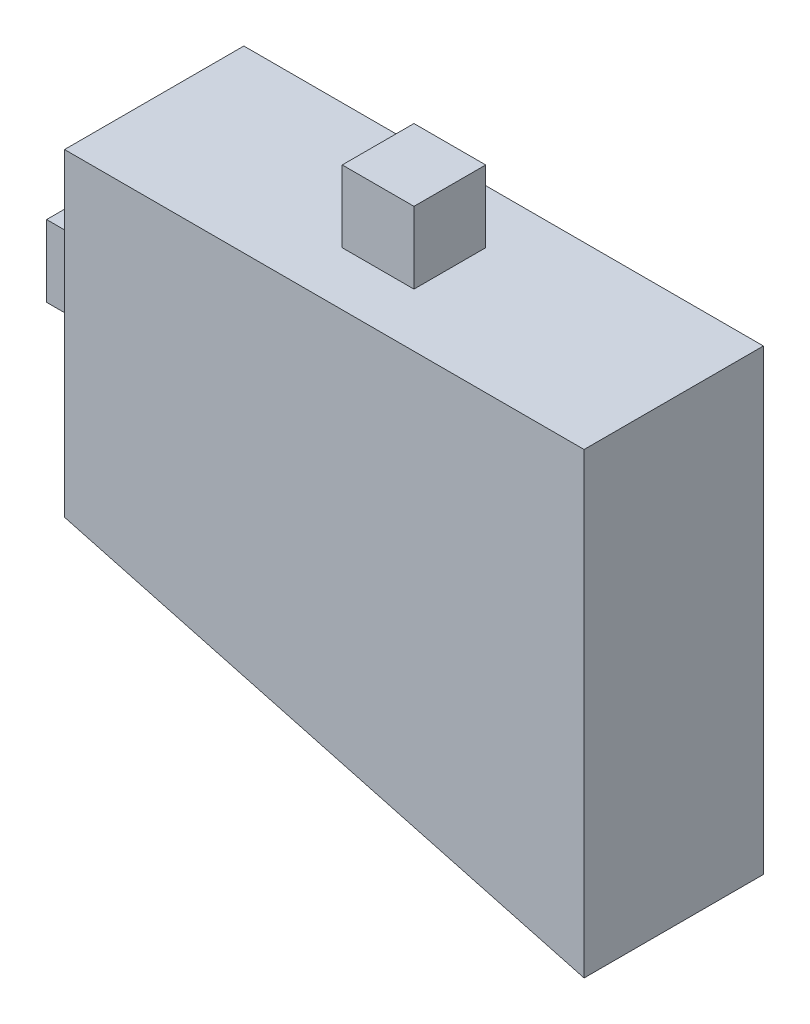
ISO-10303-21;
HEADER;
FILE_DESCRIPTION(('STEP AP214'),'2;1');
FILE_NAME('part.step','',(''),(''),'','','');
FILE_SCHEMA(('AUTOMOTIVE_DESIGN { 1 0 10303 214 1 1 1 1 }'));
ENDSEC;
DATA;
#1=APPLICATION_CONTEXT('core data for automotive mechanical design processes');
#2=APPLICATION_PROTOCOL_DEFINITION('international standard','automotive_design',2000,#1);
#3=PRODUCT_CONTEXT('',#1,'mechanical');
#4=PRODUCT('Part','Part','',(#3));
#5=PRODUCT_RELATED_PRODUCT_CATEGORY('part','',(#4));
#6=PRODUCT_DEFINITION_FORMATION('','',#4);
#7=PRODUCT_DEFINITION_CONTEXT('part definition',#1,'design');
#8=PRODUCT_DEFINITION('design','',#6,#7);
#9=PRODUCT_DEFINITION_SHAPE('','',#8);
#10=(LENGTH_UNIT() NAMED_UNIT(*) SI_UNIT(.MILLI.,.METRE.));
#11=(NAMED_UNIT(*) PLANE_ANGLE_UNIT() SI_UNIT($,.RADIAN.));
#12=(NAMED_UNIT(*) SI_UNIT($,.STERADIAN.) SOLID_ANGLE_UNIT());
#13=UNCERTAINTY_MEASURE_WITH_UNIT(LENGTH_MEASURE(1.E-05),#10,'distance_accuracy_value','');
#14=(GEOMETRIC_REPRESENTATION_CONTEXT(3) GLOBAL_UNCERTAINTY_ASSIGNED_CONTEXT((#13)) GLOBAL_UNIT_ASSIGNED_CONTEXT((#10,
#11,#12)) REPRESENTATION_CONTEXT('',''));
#15=CARTESIAN_POINT('',(0.,0.,0.));
#16=DIRECTION('',(0.,0.,1.));
#17=DIRECTION('',(1.,0.,0.));
#18=AXIS2_PLACEMENT_3D('',#15,#16,#17);
#19=CARTESIAN_POINT('',(110.57764421791,0.,0.));
#20=DIRECTION('',(-1.,0.,0.));
#21=DIRECTION('',(0.,-1.,0.));
#22=AXIS2_PLACEMENT_3D('',#19,#20,#21);
#23=PLANE('',#22);
#24=DIRECTION('',(0.,-1.,0.));
#25=VECTOR('',#24,1.);
#26=CARTESIAN_POINT('',(110.57764421791,31.6424845178765,50.));
#27=LINE('',#26,#25);
#28=CARTESIAN_POINT('',(110.57764421791,-18.2414554532318,50.));
#29=VERTEX_POINT('',#28);
#30=CARTESIAN_POINT('',(110.57764421791,-107.064312218609,50.));
#31=VERTEX_POINT('',#30);
#32=EDGE_CURVE('E241',#29,#31,#27,.T.);
#33=ORIENTED_EDGE('',*,*,#32,.F.);
#34=DIRECTION('',(0.,0.,-1.));
#35=VECTOR('',#34,1.);
#36=CARTESIAN_POINT('',(110.57764421791,-18.2414554532318,0.));
#37=LINE('',#36,#35);
#38=CARTESIAN_POINT('',(110.57764421791,-18.2414554532318,0.));
#39=VERTEX_POINT('',#38);
#40=EDGE_CURVE('E245',#29,#39,#37,.T.);
#41=ORIENTED_EDGE('',*,*,#40,.T.);
#42=DIRECTION('',(0.,-1.,0.));
#43=VECTOR('',#42,1.);
#44=CARTESIAN_POINT('',(110.57764421791,31.7585445467682,0.));
#45=LINE('',#44,#43);
#46=CARTESIAN_POINT('',(110.57764421791,-107.064312218609,0.));
#47=VERTEX_POINT('',#46);
#48=EDGE_CURVE('E223',#39,#47,#45,.T.);
#49=ORIENTED_EDGE('',*,*,#48,.T.);
#50=DIRECTION('',(0.,0.,-1.));
#51=VECTOR('',#50,1.);
#52=CARTESIAN_POINT('',(110.57764421791,-107.064312218609,50.));
#53=LINE('',#52,#51);
#54=EDGE_CURVE('E229',#31,#47,#53,.T.);
#55=ORIENTED_EDGE('',*,*,#54,.F.);
#56=EDGE_LOOP('',(#33,#41,#49,#55));
#57=FACE_BOUND('',#56,.T.);
#58=DIRECTION('',(0.,0.,1.));
#59=VECTOR('',#58,1.);
#60=CARTESIAN_POINT('',(110.57764421791,-52.6528838359204,0.));
#61=LINE('',#60,#59);
#62=CARTESIAN_POINT('',(110.57764421791,-52.6528838359204,15.));
#63=VERTEX_POINT('',#62);
#64=CARTESIAN_POINT('',(110.57764421791,-52.6528838359204,35.));
#65=VERTEX_POINT('',#64);
#66=EDGE_CURVE('E200',#63,#65,#61,.T.);
#67=ORIENTED_EDGE('',*,*,#66,.T.);
#68=DIRECTION('',(0.,-1.,0.));
#69=VECTOR('',#68,1.);
#70=CARTESIAN_POINT('',(110.57764421791,0.,35.));
#71=LINE('',#70,#69);
#72=CARTESIAN_POINT('',(110.57764421791,-72.6528838359204,35.));
#73=VERTEX_POINT('',#72);
#74=EDGE_CURVE('E140',#65,#73,#71,.T.);
#75=ORIENTED_EDGE('',*,*,#74,.T.);
#76=DIRECTION('',(0.,0.,1.));
#77=VECTOR('',#76,1.);
#78=CARTESIAN_POINT('',(110.57764421791,-72.6528838359204,0.));
#79=LINE('',#78,#77);
#80=CARTESIAN_POINT('',(110.57764421791,-72.6528838359204,15.));
#81=VERTEX_POINT('',#80);
#82=EDGE_CURVE('E186',#81,#73,#79,.T.);
#83=ORIENTED_EDGE('',*,*,#82,.F.);
#84=DIRECTION('',(0.,-1.,0.));
#85=VECTOR('',#84,1.);
#86=CARTESIAN_POINT('',(110.57764421791,0.,15.0000000000002));
#87=LINE('',#86,#85);
#88=EDGE_CURVE('E204',#63,#81,#87,.T.);
#89=ORIENTED_EDGE('',*,*,#88,.F.);
#90=EDGE_LOOP('',(#67,#75,#83,#89));
#91=FACE_BOUND('',#90,.T.);
#92=ADVANCED_FACE('F41',(#57,#91),#23,.T.);
#93=CARTESIAN_POINT('',(0.,-18.2414554532318,0.));
#94=DIRECTION('',(0.,-1.,0.));
#95=DIRECTION('',(1.,0.,0.));
#96=AXIS2_PLACEMENT_3D('',#93,#94,#95);
#97=PLANE('',#96);
#98=DIRECTION('',(1.,0.,0.));
#99=VECTOR('',#98,1.);
#100=CARTESIAN_POINT('',(0.,-18.2414554532318,15.));
#101=LINE('',#100,#99);
#102=CARTESIAN_POINT('',(173.02208118959,-18.2414554532318,15.));
#103=VERTEX_POINT('',#102);
#104=CARTESIAN_POINT('',(193.02208118959,-18.2414554532318,15.));
#105=VERTEX_POINT('',#104);
#106=EDGE_CURVE('E58',#103,#105,#101,.T.);
#107=ORIENTED_EDGE('',*,*,#106,.T.);
#108=DIRECTION('',(0.,0.,1.));
#109=VECTOR('',#108,1.);
#110=CARTESIAN_POINT('',(193.02208118959,-18.2414554532318,-2.67871948497186E-13));
#111=LINE('',#110,#109);
#112=CARTESIAN_POINT('',(193.02208118959,-18.2414554532318,35.));
#113=VERTEX_POINT('',#112);
#114=EDGE_CURVE('E136',#105,#113,#111,.T.);
#115=ORIENTED_EDGE('',*,*,#114,.T.);
#116=DIRECTION('',(1.,0.,0.));
#117=VECTOR('',#116,1.);
#118=CARTESIAN_POINT('',(0.,-18.2414554532318,35.));
#119=LINE('',#118,#117);
#120=CARTESIAN_POINT('',(173.02208118959,-18.2414554532318,35.));
#121=VERTEX_POINT('',#120);
#122=EDGE_CURVE('E151',#121,#113,#119,.T.);
#123=ORIENTED_EDGE('',*,*,#122,.F.);
#124=DIRECTION('',(0.,0.,1.));
#125=VECTOR('',#124,1.);
#126=CARTESIAN_POINT('',(173.02208118959,-18.2414554532318,-2.40116372881557E-13));
#127=LINE('',#126,#125);
#128=EDGE_CURVE('E63',#103,#121,#127,.T.);
#129=ORIENTED_EDGE('',*,*,#128,.F.);
#130=EDGE_LOOP('',(#107,#115,#123,#129));
#131=FACE_BOUND('',#130,.T.);
#132=ORIENTED_EDGE('',*,*,#40,.F.);
#133=DIRECTION('',(1.,0.,0.));
#134=VECTOR('',#133,1.);
#135=CARTESIAN_POINT('',(45.6887702745492,-18.2414554532318,50.));
#136=LINE('',#135,#134);
#137=CARTESIAN_POINT('',(255.46651816127,-18.2414554532318,50.));
#138=VERTEX_POINT('',#137);
#139=EDGE_CURVE('E228',#29,#138,#136,.T.);
#140=ORIENTED_EDGE('',*,*,#139,.T.);
#141=DIRECTION('',(0.,0.,-1.));
#142=VECTOR('',#141,1.);
#143=CARTESIAN_POINT('',(255.46651816127,-18.2414554532318,50.));
#144=LINE('',#143,#142);
#145=CARTESIAN_POINT('',(255.46651816127,-18.2414554532318,0.));
#146=VERTEX_POINT('',#145);
#147=EDGE_CURVE('E224',#138,#146,#144,.T.);
#148=ORIENTED_EDGE('',*,*,#147,.T.);
#149=DIRECTION('',(1.,0.,0.));
#150=VECTOR('',#149,1.);
#151=CARTESIAN_POINT('',(-34.3112297254508,-18.2414554532318,0.));
#152=LINE('',#151,#150);
#153=EDGE_CURVE('E236',#39,#146,#152,.T.);
#154=ORIENTED_EDGE('',*,*,#153,.F.);
#155=EDGE_LOOP('',(#132,#140,#148,#154));
#156=FACE_BOUND('',#155,.T.);
#157=ADVANCED_FACE('F270',(#131,#156),#97,.F.);
#158=CARTESIAN_POINT('',(45.6887702745492,31.6424845178765,50.));
#159=DIRECTION('',(0.,0.,1.));
#160=DIRECTION('',(1.,0.,0.));
#161=AXIS2_PLACEMENT_3D('',#158,#159,#160);
#162=PLANE('',#161);
#163=ORIENTED_EDGE('',*,*,#139,.F.);
#164=ORIENTED_EDGE('',*,*,#32,.T.);
#165=DIRECTION('',(-0.96592582628907,0.258819045102514,0.));
#166=VECTOR('',#165,1.);
#167=CARTESIAN_POINT('',(-34.3112297254508,-68.2414554532319,50.));
#168=LINE('',#167,#166);
#169=CARTESIAN_POINT('',(255.46651816127,-145.887168983986,50.));
#170=VERTEX_POINT('',#169);
#171=EDGE_CURVE('E45',#170,#31,#168,.T.);
#172=ORIENTED_EDGE('',*,*,#171,.F.);
#173=DIRECTION('',(0.,-1.,0.));
#174=VECTOR('',#173,1.);
#175=CARTESIAN_POINT('',(255.46651816127,-145.887168983986,50.));
#176=LINE('',#175,#174);
#177=EDGE_CURVE('E230',#138,#170,#176,.T.);
#178=ORIENTED_EDGE('',*,*,#177,.F.);
#179=EDGE_LOOP('',(#163,#164,#172,#178));
#180=FACE_BOUND('',#179,.T.);
#181=ADVANCED_FACE('F274',(#180),#162,.T.);
#182=CARTESIAN_POINT('',(-34.3112297254508,-68.2414554532319,50.));
#183=DIRECTION('',(-0.258819045102514,-0.96592582628907,0.));
#184=DIRECTION('',(0.96592582628907,-0.258819045102514,0.));
#185=AXIS2_PLACEMENT_3D('',#182,#183,#184);
#186=PLANE('',#185);
#187=ORIENTED_EDGE('',*,*,#171,.T.);
#188=ORIENTED_EDGE('',*,*,#54,.T.);
#189=DIRECTION('',(-0.96592582628907,0.258819045102514,0.));
#190=VECTOR('',#189,1.);
#191=CARTESIAN_POINT('',(-34.3112297254508,-68.2414554532319,0.));
#192=LINE('',#191,#190);
#193=CARTESIAN_POINT('',(255.46651816127,-145.887168983986,0.));
#194=VERTEX_POINT('',#193);
#195=EDGE_CURVE('E233',#194,#47,#192,.T.);
#196=ORIENTED_EDGE('',*,*,#195,.F.);
#197=DIRECTION('',(0.,0.,-1.));
#198=VECTOR('',#197,1.);
#199=CARTESIAN_POINT('',(255.46651816127,-145.887168983986,50.));
#200=LINE('',#199,#198);
#201=EDGE_CURVE('E11',#170,#194,#200,.T.);
#202=ORIENTED_EDGE('',*,*,#201,.F.);
#203=EDGE_LOOP('',(#187,#188,#196,#202));
#204=FACE_BOUND('',#203,.T.);
#205=ADVANCED_FACE('F263',(#204),#186,.T.);
#206=CARTESIAN_POINT('',(-34.3112297254508,31.7585445467682,0.));
#207=DIRECTION('',(0.,0.,1.));
#208=DIRECTION('',(1.,0.,0.));
#209=AXIS2_PLACEMENT_3D('',#206,#207,#208);
#210=PLANE('',#209);
#211=ORIENTED_EDGE('',*,*,#48,.F.);
#212=ORIENTED_EDGE('',*,*,#153,.T.);
#213=DIRECTION('',(0.,-1.,0.));
#214=VECTOR('',#213,1.);
#215=CARTESIAN_POINT('',(255.46651816127,-145.887168983986,0.));
#216=LINE('',#215,#214);
#217=EDGE_CURVE('E234',#146,#194,#216,.T.);
#218=ORIENTED_EDGE('',*,*,#217,.T.);
#219=ORIENTED_EDGE('',*,*,#195,.T.);
#220=EDGE_LOOP('',(#211,#212,#218,#219));
#221=FACE_BOUND('',#220,.T.);
#222=ADVANCED_FACE('F43',(#221),#210,.F.);
#223=CARTESIAN_POINT('',(255.46651816127,-145.887168983986,50.));
#224=DIRECTION('',(1.,0.,0.));
#225=DIRECTION('',(0.,0.,-1.));
#226=AXIS2_PLACEMENT_3D('',#223,#224,#225);
#227=PLANE('',#226);
#228=ORIENTED_EDGE('',*,*,#147,.F.);
#229=ORIENTED_EDGE('',*,*,#177,.T.);
#230=ORIENTED_EDGE('',*,*,#201,.T.);
#231=ORIENTED_EDGE('',*,*,#217,.F.);
#232=EDGE_LOOP('',(#228,#229,#230,#231));
#233=FACE_BOUND('',#232,.T.);
#234=ADVANCED_FACE('F276',(#233),#227,.T.);
#235=CARTESIAN_POINT('',(90.5776442179097,0.,35.));
#236=DIRECTION('',(0.,0.,1.));
#237=DIRECTION('',(1.,0.,0.));
#238=AXIS2_PLACEMENT_3D('',#235,#236,#237);
#239=PLANE('',#238);
#240=ORIENTED_EDGE('',*,*,#74,.F.);
#241=DIRECTION('',(1.,0.,0.));
#242=VECTOR('',#241,1.);
#243=CARTESIAN_POINT('',(90.5776442179097,-52.6528838359204,35.));
#244=LINE('',#243,#242);
#245=CARTESIAN_POINT('',(90.5776442179097,-52.6528838359204,35.));
#246=VERTEX_POINT('',#245);
#247=EDGE_CURVE('E219',#246,#65,#244,.T.);
#248=ORIENTED_EDGE('',*,*,#247,.F.);
#249=DIRECTION('',(0.,-1.,0.));
#250=VECTOR('',#249,1.);
#251=CARTESIAN_POINT('',(90.5776442179097,0.,35.));
#252=LINE('',#251,#250);
#253=CARTESIAN_POINT('',(90.5776442179097,-72.6528838359204,35.));
#254=VERTEX_POINT('',#253);
#255=EDGE_CURVE('E181',#246,#254,#252,.T.);
#256=ORIENTED_EDGE('',*,*,#255,.T.);
#257=DIRECTION('',(1.,0.,0.));
#258=VECTOR('',#257,1.);
#259=CARTESIAN_POINT('',(90.5776442179097,-72.6528838359204,35.));
#260=LINE('',#259,#258);
#261=EDGE_CURVE('E196',#254,#73,#260,.T.);
#262=ORIENTED_EDGE('',*,*,#261,.T.);
#263=EDGE_LOOP('',(#240,#248,#256,#262));
#264=FACE_BOUND('',#263,.T.);
#265=ADVANCED_FACE('F278',(#264),#239,.T.);
#266=CARTESIAN_POINT('',(90.5776442179097,-52.6528838359204,0.));
#267=DIRECTION('',(0.,1.,0.));
#268=DIRECTION('',(-1.,0.,0.));
#269=AXIS2_PLACEMENT_3D('',#266,#267,#268);
#270=PLANE('',#269);
#271=ORIENTED_EDGE('',*,*,#66,.F.);
#272=DIRECTION('',(1.,0.,0.));
#273=VECTOR('',#272,1.);
#274=CARTESIAN_POINT('',(90.5776442179097,-52.6528838359204,15.));
#275=LINE('',#274,#273);
#276=CARTESIAN_POINT('',(90.5776442179097,-52.6528838359204,15.));
#277=VERTEX_POINT('',#276);
#278=EDGE_CURVE('E216',#277,#63,#275,.T.);
#279=ORIENTED_EDGE('',*,*,#278,.F.);
#280=DIRECTION('',(0.,0.,1.));
#281=VECTOR('',#280,1.);
#282=CARTESIAN_POINT('',(90.5776442179097,-52.6528838359204,0.));
#283=LINE('',#282,#281);
#284=EDGE_CURVE('E185',#277,#246,#283,.T.);
#285=ORIENTED_EDGE('',*,*,#284,.T.);
#286=ORIENTED_EDGE('',*,*,#247,.T.);
#287=EDGE_LOOP('',(#271,#279,#285,#286));
#288=FACE_BOUND('',#287,.T.);
#289=ADVANCED_FACE('F285',(#288),#270,.T.);
#290=CARTESIAN_POINT('',(90.5776442179097,0.,15.0000000000002));
#291=DIRECTION('',(0.,0.,1.));
#292=DIRECTION('',(0.,-1.,0.));
#293=AXIS2_PLACEMENT_3D('',#290,#291,#292);
#294=PLANE('',#293);
#295=ORIENTED_EDGE('',*,*,#88,.T.);
#296=DIRECTION('',(1.,0.,0.));
#297=VECTOR('',#296,1.);
#298=CARTESIAN_POINT('',(90.5776442179097,-72.6528838359204,15.));
#299=LINE('',#298,#297);
#300=CARTESIAN_POINT('',(90.5776442179097,-72.6528838359204,15.));
#301=VERTEX_POINT('',#300);
#302=EDGE_CURVE('E212',#301,#81,#299,.T.);
#303=ORIENTED_EDGE('',*,*,#302,.F.);
#304=DIRECTION('',(0.,-1.,0.));
#305=VECTOR('',#304,1.);
#306=CARTESIAN_POINT('',(90.5776442179097,0.,15.0000000000002));
#307=LINE('',#306,#305);
#308=EDGE_CURVE('E190',#277,#301,#307,.T.);
#309=ORIENTED_EDGE('',*,*,#308,.F.);
#310=ORIENTED_EDGE('',*,*,#278,.T.);
#311=EDGE_LOOP('',(#295,#303,#309,#310));
#312=FACE_BOUND('',#311,.T.);
#313=ADVANCED_FACE('F332',(#312),#294,.F.);
#314=CARTESIAN_POINT('',(90.5776442179097,-72.6528838359204,0.));
#315=DIRECTION('',(0.,1.,0.));
#316=DIRECTION('',(-1.,0.,0.));
#317=AXIS2_PLACEMENT_3D('',#314,#315,#316);
#318=PLANE('',#317);
#319=ORIENTED_EDGE('',*,*,#82,.T.);
#320=ORIENTED_EDGE('',*,*,#261,.F.);
#321=DIRECTION('',(0.,0.,1.));
#322=VECTOR('',#321,1.);
#323=CARTESIAN_POINT('',(90.5776442179097,-72.6528838359204,0.));
#324=LINE('',#323,#322);
#325=EDGE_CURVE('E193',#301,#254,#324,.T.);
#326=ORIENTED_EDGE('',*,*,#325,.F.);
#327=ORIENTED_EDGE('',*,*,#302,.T.);
#328=EDGE_LOOP('',(#319,#320,#326,#327));
#329=FACE_BOUND('',#328,.T.);
#330=ADVANCED_FACE('F341',(#329),#318,.F.);
#331=CARTESIAN_POINT('',(90.5776442179097,0.,0.));
#332=DIRECTION('',(-1.,0.,0.));
#333=DIRECTION('',(0.,-1.,0.));
#334=AXIS2_PLACEMENT_3D('',#331,#332,#333);
#335=PLANE('',#334);
#336=ORIENTED_EDGE('',*,*,#255,.F.);
#337=ORIENTED_EDGE('',*,*,#284,.F.);
#338=ORIENTED_EDGE('',*,*,#308,.T.);
#339=ORIENTED_EDGE('',*,*,#325,.T.);
#340=EDGE_LOOP('',(#336,#337,#338,#339));
#341=FACE_BOUND('',#340,.T.);
#342=ADVANCED_FACE('F350',(#341),#335,.T.);
#343=CARTESIAN_POINT('',(193.02208118959,1.75854454676817,-2.67871948497186E-13));
#344=DIRECTION('',(1.,0.,0.));
#345=DIRECTION('',(0.,0.,-1.));
#346=AXIS2_PLACEMENT_3D('',#343,#344,#345);
#347=PLANE('',#346);
#348=ORIENTED_EDGE('',*,*,#114,.F.);
#349=DIRECTION('',(0.,-1.,0.));
#350=VECTOR('',#349,1.);
#351=CARTESIAN_POINT('',(193.02208118959,1.75854454676817,15.));
#352=LINE('',#351,#350);
#353=CARTESIAN_POINT('',(193.02208118959,1.75854454676817,15.));
#354=VERTEX_POINT('',#353);
#355=EDGE_CURVE('E131',#354,#105,#352,.T.);
#356=ORIENTED_EDGE('',*,*,#355,.F.);
#357=DIRECTION('',(0.,0.,1.));
#358=VECTOR('',#357,1.);
#359=CARTESIAN_POINT('',(193.02208118959,1.75854454676817,-2.67871948497186E-13));
#360=LINE('',#359,#358);
#361=CARTESIAN_POINT('',(193.02208118959,1.75854454676817,35.));
#362=VERTEX_POINT('',#361);
#363=EDGE_CURVE('E135',#354,#362,#360,.T.);
#364=ORIENTED_EDGE('',*,*,#363,.T.);
#365=DIRECTION('',(0.,-1.,0.));
#366=VECTOR('',#365,1.);
#367=CARTESIAN_POINT('',(193.02208118959,1.75854454676817,35.));
#368=LINE('',#367,#366);
#369=EDGE_CURVE('E163',#362,#113,#368,.T.);
#370=ORIENTED_EDGE('',*,*,#369,.T.);
#371=EDGE_LOOP('',(#348,#356,#364,#370));
#372=FACE_BOUND('',#371,.T.);
#373=ADVANCED_FACE('F133',(#372),#347,.T.);
#374=CARTESIAN_POINT('',(0.,1.75854454676816,15.));
#375=DIRECTION('',(0.,0.,-1.));
#376=DIRECTION('',(-1.,0.,0.));
#377=AXIS2_PLACEMENT_3D('',#374,#375,#376);
#378=PLANE('',#377);
#379=ORIENTED_EDGE('',*,*,#106,.F.);
#380=DIRECTION('',(0.,-1.,0.));
#381=VECTOR('',#380,1.);
#382=CARTESIAN_POINT('',(173.02208118959,1.75854454676817,15.));
#383=LINE('',#382,#381);
#384=CARTESIAN_POINT('',(173.02208118959,1.75854454676817,15.));
#385=VERTEX_POINT('',#384);
#386=EDGE_CURVE('E141',#385,#103,#383,.T.);
#387=ORIENTED_EDGE('',*,*,#386,.F.);
#388=DIRECTION('',(1.,0.,0.));
#389=VECTOR('',#388,1.);
#390=CARTESIAN_POINT('',(0.,1.75854454676816,15.));
#391=LINE('',#390,#389);
#392=EDGE_CURVE('E146',#385,#354,#391,.T.);
#393=ORIENTED_EDGE('',*,*,#392,.T.);
#394=ORIENTED_EDGE('',*,*,#355,.T.);
#395=EDGE_LOOP('',(#379,#387,#393,#394));
#396=FACE_BOUND('',#395,.T.);
#397=ADVANCED_FACE('F153',(#396),#378,.T.);
#398=CARTESIAN_POINT('',(173.02208118959,1.75854454676817,-2.40116372881557E-13));
#399=DIRECTION('',(1.,0.,0.));
#400=DIRECTION('',(0.,0.,-1.));
#401=AXIS2_PLACEMENT_3D('',#398,#399,#400);
#402=PLANE('',#401);
#403=ORIENTED_EDGE('',*,*,#128,.T.);
#404=DIRECTION('',(0.,-1.,0.));
#405=VECTOR('',#404,1.);
#406=CARTESIAN_POINT('',(173.02208118959,1.75854454676817,35.));
#407=LINE('',#406,#405);
#408=CARTESIAN_POINT('',(173.02208118959,1.75854454676817,35.));
#409=VERTEX_POINT('',#408);
#410=EDGE_CURVE('E175',#409,#121,#407,.T.);
#411=ORIENTED_EDGE('',*,*,#410,.F.);
#412=DIRECTION('',(0.,0.,1.));
#413=VECTOR('',#412,1.);
#414=CARTESIAN_POINT('',(173.02208118959,1.75854454676817,-2.40116372881557E-13));
#415=LINE('',#414,#413);
#416=EDGE_CURVE('E156',#385,#409,#415,.T.);
#417=ORIENTED_EDGE('',*,*,#416,.F.);
#418=ORIENTED_EDGE('',*,*,#386,.T.);
#419=EDGE_LOOP('',(#403,#411,#417,#418));
#420=FACE_BOUND('',#419,.T.);
#421=ADVANCED_FACE('F377',(#420),#402,.F.);
#422=CARTESIAN_POINT('',(0.,1.75854454676816,35.));
#423=DIRECTION('',(0.,0.,-1.));
#424=DIRECTION('',(-1.,0.,0.));
#425=AXIS2_PLACEMENT_3D('',#422,#423,#424);
#426=PLANE('',#425);
#427=ORIENTED_EDGE('',*,*,#122,.T.);
#428=ORIENTED_EDGE('',*,*,#369,.F.);
#429=DIRECTION('',(1.,0.,0.));
#430=VECTOR('',#429,1.);
#431=CARTESIAN_POINT('',(0.,1.75854454676816,35.));
#432=LINE('',#431,#430);
#433=EDGE_CURVE('E148',#409,#362,#432,.T.);
#434=ORIENTED_EDGE('',*,*,#433,.F.);
#435=ORIENTED_EDGE('',*,*,#410,.T.);
#436=EDGE_LOOP('',(#427,#428,#434,#435));
#437=FACE_BOUND('',#436,.T.);
#438=ADVANCED_FACE('F385',(#437),#426,.F.);
#439=CARTESIAN_POINT('',(0.,1.75854454676816,0.));
#440=DIRECTION('',(0.,1.,0.));
#441=DIRECTION('',(-1.,0.,0.));
#442=AXIS2_PLACEMENT_3D('',#439,#440,#441);
#443=PLANE('',#442);
#444=ORIENTED_EDGE('',*,*,#363,.F.);
#445=ORIENTED_EDGE('',*,*,#392,.F.);
#446=ORIENTED_EDGE('',*,*,#416,.T.);
#447=ORIENTED_EDGE('',*,*,#433,.T.);
#448=EDGE_LOOP('',(#444,#445,#446,#447));
#449=FACE_BOUND('',#448,.T.);
#450=ADVANCED_FACE('F145',(#449),#443,.T.);
#451=CLOSED_SHELL('',(#92,#157,#181,#205,#222,#234,#265,#289,#313,#330,#342,#373,#397,#421,#438,#450));
#452=MANIFOLD_SOLID_BREP('B2',#451);
#453=ADVANCED_BREP_SHAPE_REPRESENTATION('',(#18,#452),#14);
#454=SHAPE_DEFINITION_REPRESENTATION(#9,#453);
ENDSEC;
END-ISO-10303-21;
